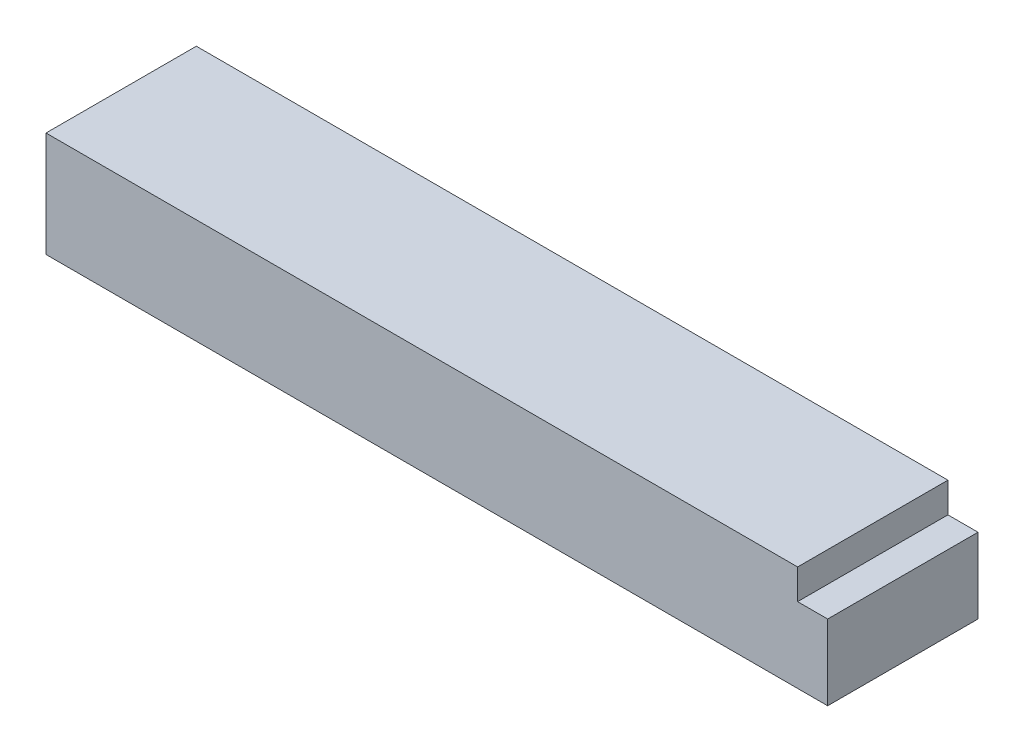
ISO-10303-21;
HEADER;
FILE_DESCRIPTION(('STEP AP214'),'2;1');
FILE_NAME('part.step','',(''),(''),'','','');
FILE_SCHEMA(('AUTOMOTIVE_DESIGN { 1 0 10303 214 1 1 1 1 }'));
ENDSEC;
DATA;
#1=APPLICATION_CONTEXT('core data for automotive mechanical design processes');
#2=APPLICATION_PROTOCOL_DEFINITION('international standard','automotive_design',2000,#1);
#3=PRODUCT_CONTEXT('',#1,'mechanical');
#4=PRODUCT('Part','Part','',(#3));
#5=PRODUCT_RELATED_PRODUCT_CATEGORY('part','',(#4));
#6=PRODUCT_DEFINITION_FORMATION('','',#4);
#7=PRODUCT_DEFINITION_CONTEXT('part definition',#1,'design');
#8=PRODUCT_DEFINITION('design','',#6,#7);
#9=PRODUCT_DEFINITION_SHAPE('','',#8);
#10=(LENGTH_UNIT() NAMED_UNIT(*) SI_UNIT(.MILLI.,.METRE.));
#11=(NAMED_UNIT(*) PLANE_ANGLE_UNIT() SI_UNIT($,.RADIAN.));
#12=(NAMED_UNIT(*) SI_UNIT($,.STERADIAN.) SOLID_ANGLE_UNIT());
#13=UNCERTAINTY_MEASURE_WITH_UNIT(LENGTH_MEASURE(1.E-05),#10,'distance_accuracy_value','');
#14=(GEOMETRIC_REPRESENTATION_CONTEXT(3) GLOBAL_UNCERTAINTY_ASSIGNED_CONTEXT((#13)) GLOBAL_UNIT_ASSIGNED_CONTEXT((#10,
#11,#12)) REPRESENTATION_CONTEXT('',''));
#15=CARTESIAN_POINT('',(0.,0.,0.));
#16=DIRECTION('',(0.,0.,1.));
#17=DIRECTION('',(1.,0.,0.));
#18=AXIS2_PLACEMENT_3D('',#15,#16,#17);
#19=CARTESIAN_POINT('',(10.1379310344828,8.39655172413793,20.));
#20=DIRECTION('',(0.,-1.,0.));
#21=DIRECTION('',(1.,0.,0.));
#22=AXIS2_PLACEMENT_3D('',#19,#20,#21);
#23=PLANE('',#22);
#24=DIRECTION('',(-1.,0.,0.));
#25=VECTOR('',#24,1.);
#26=CARTESIAN_POINT('',(10.1379310344828,8.39655172413793,0.));
#27=LINE('',#26,#25);
#28=CARTESIAN_POINT('',(10.1379310344828,8.39655172413793,0.));
#29=VERTEX_POINT('',#28);
#30=CARTESIAN_POINT('',(-89.8620689655172,8.39655172413792,0.));
#31=VERTEX_POINT('',#30);
#32=EDGE_CURVE('E128',#29,#31,#27,.T.);
#33=ORIENTED_EDGE('',*,*,#32,.T.);
#34=DIRECTION('',(0.,0.,-1.));
#35=VECTOR('',#34,1.);
#36=CARTESIAN_POINT('',(-89.8620689655172,8.39655172413792,20.));
#37=LINE('',#36,#35);
#38=CARTESIAN_POINT('',(-89.8620689655172,8.39655172413792,20.));
#39=VERTEX_POINT('',#38);
#40=EDGE_CURVE('E11',#39,#31,#37,.T.);
#41=ORIENTED_EDGE('',*,*,#40,.F.);
#42=DIRECTION('',(-1.,0.,0.));
#43=VECTOR('',#42,1.);
#44=CARTESIAN_POINT('',(10.1379310344828,8.39655172413793,20.));
#45=LINE('',#44,#43);
#46=CARTESIAN_POINT('',(10.1379310344828,8.39655172413793,20.));
#47=VERTEX_POINT('',#46);
#48=EDGE_CURVE('E144',#47,#39,#45,.T.);
#49=ORIENTED_EDGE('',*,*,#48,.F.);
#50=DIRECTION('',(0.,0.,-1.));
#51=VECTOR('',#50,1.);
#52=CARTESIAN_POINT('',(10.1379310344828,8.39655172413793,20.));
#53=LINE('',#52,#51);
#54=EDGE_CURVE('E124',#47,#29,#53,.T.);
#55=ORIENTED_EDGE('',*,*,#54,.T.);
#56=EDGE_LOOP('',(#33,#41,#49,#55));
#57=FACE_BOUND('',#56,.T.);
#58=ADVANCED_FACE('F39',(#57),#23,.F.);
#59=CARTESIAN_POINT('',(-89.8620689655172,8.39655172413792,20.));
#60=DIRECTION('',(1.,0.,0.));
#61=DIRECTION('',(0.,0.,-1.));
#62=AXIS2_PLACEMENT_3D('',#59,#60,#61);
#63=PLANE('',#62);
#64=DIRECTION('',(0.,-1.,0.));
#65=VECTOR('',#64,1.);
#66=CARTESIAN_POINT('',(-89.8620689655172,8.39655172413792,0.));
#67=LINE('',#66,#65);
#68=CARTESIAN_POINT('',(-89.8620689655172,-5.60344827586207,0.));
#69=VERTEX_POINT('',#68);
#70=EDGE_CURVE('E132',#31,#69,#67,.T.);
#71=ORIENTED_EDGE('',*,*,#70,.T.);
#72=DIRECTION('',(0.,0.,-1.));
#73=VECTOR('',#72,1.);
#74=CARTESIAN_POINT('',(-89.8620689655172,-5.60344827586207,20.));
#75=LINE('',#74,#73);
#76=CARTESIAN_POINT('',(-89.8620689655172,-5.60344827586207,20.));
#77=VERTEX_POINT('',#76);
#78=EDGE_CURVE('E48',#77,#69,#75,.T.);
#79=ORIENTED_EDGE('',*,*,#78,.F.);
#80=DIRECTION('',(0.,-1.,0.));
#81=VECTOR('',#80,1.);
#82=CARTESIAN_POINT('',(-89.8620689655172,8.39655172413792,20.));
#83=LINE('',#82,#81);
#84=EDGE_CURVE('E93',#39,#77,#83,.T.);
#85=ORIENTED_EDGE('',*,*,#84,.F.);
#86=ORIENTED_EDGE('',*,*,#40,.T.);
#87=EDGE_LOOP('',(#71,#79,#85,#86));
#88=FACE_BOUND('',#87,.T.);
#89=ADVANCED_FACE('F172',(#88),#63,.F.);
#90=CARTESIAN_POINT('',(-89.8620689655172,-5.60344827586207,20.));
#91=DIRECTION('',(0.,1.,0.));
#92=DIRECTION('',(0.,0.,1.));
#93=AXIS2_PLACEMENT_3D('',#90,#91,#92);
#94=PLANE('',#93);
#95=DIRECTION('',(1.,0.,0.));
#96=VECTOR('',#95,1.);
#97=CARTESIAN_POINT('',(-89.8620689655172,-5.60344827586207,0.));
#98=LINE('',#97,#96);
#99=CARTESIAN_POINT('',(14.1379310344828,-5.60344827586207,0.));
#100=VERTEX_POINT('',#99);
#101=EDGE_CURVE('E135',#69,#100,#98,.T.);
#102=ORIENTED_EDGE('',*,*,#101,.T.);
#103=DIRECTION('',(0.,0.,-1.));
#104=VECTOR('',#103,1.);
#105=CARTESIAN_POINT('',(14.1379310344828,-5.60344827586207,20.));
#106=LINE('',#105,#104);
#107=CARTESIAN_POINT('',(14.1379310344828,-5.60344827586207,20.));
#108=VERTEX_POINT('',#107);
#109=EDGE_CURVE('E117',#108,#100,#106,.T.);
#110=ORIENTED_EDGE('',*,*,#109,.F.);
#111=DIRECTION('',(1.,0.,0.));
#112=VECTOR('',#111,1.);
#113=CARTESIAN_POINT('',(-89.8620689655172,-5.60344827586207,20.));
#114=LINE('',#113,#112);
#115=EDGE_CURVE('E106',#77,#108,#114,.T.);
#116=ORIENTED_EDGE('',*,*,#115,.F.);
#117=ORIENTED_EDGE('',*,*,#78,.T.);
#118=EDGE_LOOP('',(#102,#110,#116,#117));
#119=FACE_BOUND('',#118,.T.);
#120=ADVANCED_FACE('F154',(#119),#94,.F.);
#121=CARTESIAN_POINT('',(14.1379310344828,-5.60344827586207,20.));
#122=DIRECTION('',(-1.,0.,0.));
#123=DIRECTION('',(0.,0.,1.));
#124=AXIS2_PLACEMENT_3D('',#121,#122,#123);
#125=PLANE('',#124);
#126=DIRECTION('',(0.,1.,0.));
#127=VECTOR('',#126,1.);
#128=CARTESIAN_POINT('',(14.1379310344828,-5.60344827586207,0.));
#129=LINE('',#128,#127);
#130=CARTESIAN_POINT('',(14.1379310344828,4.39655172413793,0.));
#131=VERTEX_POINT('',#130);
#132=EDGE_CURVE('E115',#100,#131,#129,.T.);
#133=ORIENTED_EDGE('',*,*,#132,.T.);
#134=DIRECTION('',(0.,0.,-1.));
#135=VECTOR('',#134,1.);
#136=CARTESIAN_POINT('',(14.1379310344828,4.39655172413793,20.));
#137=LINE('',#136,#135);
#138=CARTESIAN_POINT('',(14.1379310344828,4.39655172413793,20.));
#139=VERTEX_POINT('',#138);
#140=EDGE_CURVE('E112',#139,#131,#137,.T.);
#141=ORIENTED_EDGE('',*,*,#140,.F.);
#142=DIRECTION('',(0.,1.,0.));
#143=VECTOR('',#142,1.);
#144=CARTESIAN_POINT('',(14.1379310344828,-5.60344827586207,20.));
#145=LINE('',#144,#143);
#146=EDGE_CURVE('E100',#108,#139,#145,.T.);
#147=ORIENTED_EDGE('',*,*,#146,.F.);
#148=ORIENTED_EDGE('',*,*,#109,.T.);
#149=EDGE_LOOP('',(#133,#141,#147,#148));
#150=FACE_BOUND('',#149,.T.);
#151=ADVANCED_FACE('F113',(#150),#125,.F.);
#152=CARTESIAN_POINT('',(14.1379310344828,4.39655172413793,20.));
#153=DIRECTION('',(0.,-1.,0.));
#154=DIRECTION('',(1.,0.,0.));
#155=AXIS2_PLACEMENT_3D('',#152,#153,#154);
#156=PLANE('',#155);
#157=DIRECTION('',(-1.,0.,0.));
#158=VECTOR('',#157,1.);
#159=CARTESIAN_POINT('',(14.1379310344828,4.39655172413793,0.));
#160=LINE('',#159,#158);
#161=CARTESIAN_POINT('',(10.1379310344828,4.39655172413793,0.));
#162=VERTEX_POINT('',#161);
#163=EDGE_CURVE('E79',#131,#162,#160,.T.);
#164=ORIENTED_EDGE('',*,*,#163,.T.);
#165=DIRECTION('',(0.,0.,-1.));
#166=VECTOR('',#165,1.);
#167=CARTESIAN_POINT('',(10.1379310344828,4.39655172413793,20.));
#168=LINE('',#167,#166);
#169=CARTESIAN_POINT('',(10.1379310344828,4.39655172413793,20.));
#170=VERTEX_POINT('',#169);
#171=EDGE_CURVE('E118',#170,#162,#168,.T.);
#172=ORIENTED_EDGE('',*,*,#171,.F.);
#173=DIRECTION('',(-1.,0.,0.));
#174=VECTOR('',#173,1.);
#175=CARTESIAN_POINT('',(14.1379310344828,4.39655172413793,20.));
#176=LINE('',#175,#174);
#177=EDGE_CURVE('E104',#139,#170,#176,.T.);
#178=ORIENTED_EDGE('',*,*,#177,.F.);
#179=ORIENTED_EDGE('',*,*,#140,.T.);
#180=EDGE_LOOP('',(#164,#172,#178,#179));
#181=FACE_BOUND('',#180,.T.);
#182=ADVANCED_FACE('F120',(#181),#156,.F.);
#183=CARTESIAN_POINT('',(10.1379310344828,4.39655172413793,20.));
#184=DIRECTION('',(-1.,0.,0.));
#185=DIRECTION('',(0.,0.,1.));
#186=AXIS2_PLACEMENT_3D('',#183,#184,#185);
#187=PLANE('',#186);
#188=DIRECTION('',(0.,1.,0.));
#189=VECTOR('',#188,1.);
#190=CARTESIAN_POINT('',(10.1379310344828,4.39655172413793,0.));
#191=LINE('',#190,#189);
#192=EDGE_CURVE('E85',#162,#29,#191,.T.);
#193=ORIENTED_EDGE('',*,*,#192,.T.);
#194=ORIENTED_EDGE('',*,*,#54,.F.);
#195=DIRECTION('',(0.,1.,0.));
#196=VECTOR('',#195,1.);
#197=CARTESIAN_POINT('',(10.1379310344828,4.39655172413793,20.));
#198=LINE('',#197,#196);
#199=EDGE_CURVE('E56',#170,#47,#198,.T.);
#200=ORIENTED_EDGE('',*,*,#199,.F.);
#201=ORIENTED_EDGE('',*,*,#171,.T.);
#202=EDGE_LOOP('',(#193,#194,#200,#201));
#203=FACE_BOUND('',#202,.T.);
#204=ADVANCED_FACE('F161',(#203),#187,.F.);
#205=CARTESIAN_POINT('',(0.,0.,20.));
#206=DIRECTION('',(0.,0.,1.));
#207=DIRECTION('',(1.,0.,0.));
#208=AXIS2_PLACEMENT_3D('',#205,#206,#207);
#209=PLANE('',#208);
#210=ORIENTED_EDGE('',*,*,#48,.T.);
#211=ORIENTED_EDGE('',*,*,#84,.T.);
#212=ORIENTED_EDGE('',*,*,#115,.T.);
#213=ORIENTED_EDGE('',*,*,#146,.T.);
#214=ORIENTED_EDGE('',*,*,#177,.T.);
#215=ORIENTED_EDGE('',*,*,#199,.T.);
#216=EDGE_LOOP('',(#210,#211,#212,#213,#214,#215));
#217=FACE_BOUND('',#216,.T.);
#218=ADVANCED_FACE('F102',(#217),#209,.T.);
#219=CARTESIAN_POINT('',(0.,0.,0.));
#220=DIRECTION('',(0.,0.,1.));
#221=DIRECTION('',(1.,0.,0.));
#222=AXIS2_PLACEMENT_3D('',#219,#220,#221);
#223=PLANE('',#222);
#224=ORIENTED_EDGE('',*,*,#32,.F.);
#225=ORIENTED_EDGE('',*,*,#192,.F.);
#226=ORIENTED_EDGE('',*,*,#163,.F.);
#227=ORIENTED_EDGE('',*,*,#132,.F.);
#228=ORIENTED_EDGE('',*,*,#101,.F.);
#229=ORIENTED_EDGE('',*,*,#70,.F.);
#230=EDGE_LOOP('',(#224,#225,#226,#227,#228,#229));
#231=FACE_BOUND('',#230,.T.);
#232=ADVANCED_FACE('F157',(#231),#223,.F.);
#233=CLOSED_SHELL('',(#58,#89,#120,#151,#182,#204,#218,#232));
#234=MANIFOLD_SOLID_BREP('B2',#233);
#235=ADVANCED_BREP_SHAPE_REPRESENTATION('',(#18,#234),#14);
#236=SHAPE_DEFINITION_REPRESENTATION(#9,#235);
ENDSEC;
END-ISO-10303-21;
